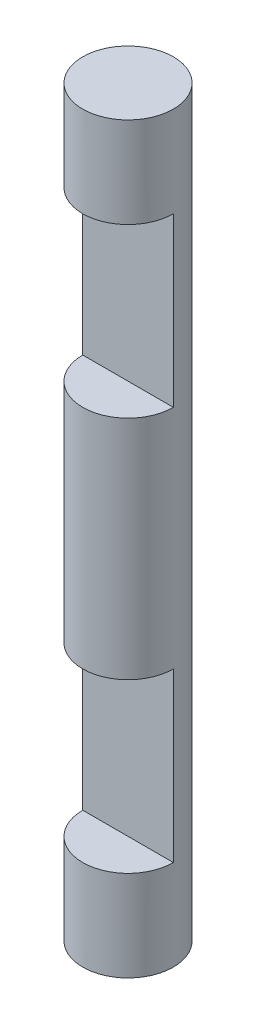
ISO-10303-21;
HEADER;
FILE_DESCRIPTION(('STEP AP214'),'2;1');
FILE_NAME('part.step','',(''),(''),'','','');
FILE_SCHEMA(('AUTOMOTIVE_DESIGN { 1 0 10303 214 1 1 1 1 }'));
ENDSEC;
DATA;
#1=APPLICATION_CONTEXT('core data for automotive mechanical design processes');
#2=APPLICATION_PROTOCOL_DEFINITION('international standard','automotive_design',2000,#1);
#3=PRODUCT_CONTEXT('',#1,'mechanical');
#4=PRODUCT('Part','Part','',(#3));
#5=PRODUCT_RELATED_PRODUCT_CATEGORY('part','',(#4));
#6=PRODUCT_DEFINITION_FORMATION('','',#4);
#7=PRODUCT_DEFINITION_CONTEXT('part definition',#1,'design');
#8=PRODUCT_DEFINITION('design','',#6,#7);
#9=PRODUCT_DEFINITION_SHAPE('','',#8);
#10=(LENGTH_UNIT() NAMED_UNIT(*) SI_UNIT(.MILLI.,.METRE.));
#11=(NAMED_UNIT(*) PLANE_ANGLE_UNIT() SI_UNIT($,.RADIAN.));
#12=(NAMED_UNIT(*) SI_UNIT($,.STERADIAN.) SOLID_ANGLE_UNIT());
#13=UNCERTAINTY_MEASURE_WITH_UNIT(LENGTH_MEASURE(1.E-05),#10,'distance_accuracy_value','');
#14=(GEOMETRIC_REPRESENTATION_CONTEXT(3) GLOBAL_UNCERTAINTY_ASSIGNED_CONTEXT((#13)) GLOBAL_UNIT_ASSIGNED_CONTEXT((#10,
#11,#12)) REPRESENTATION_CONTEXT('',''));
#15=CARTESIAN_POINT('',(0.,0.,0.));
#16=DIRECTION('',(0.,0.,1.));
#17=DIRECTION('',(1.,0.,0.));
#18=AXIS2_PLACEMENT_3D('',#15,#16,#17);
#19=CARTESIAN_POINT('',(0.,33.6284271247462,-11.));
#20=DIRECTION('',(0.,-1.,0.));
#21=DIRECTION('',(0.,0.,-1.));
#22=AXIS2_PLACEMENT_3D('',#19,#20,#21);
#23=CYLINDRICAL_SURFACE('',#22,1.);
#24=CARTESIAN_POINT('',(0.,15.4,-11.));
#25=DIRECTION('',(0.,-1.,0.));
#26=DIRECTION('',(0.,0.,-1.));
#27=AXIS2_PLACEMENT_3D('',#24,#25,#26);
#28=CIRCLE('',#27,1.);
#29=CARTESIAN_POINT('',(0.,15.4,-12.));
#30=VERTEX_POINT('',#29);
#31=EDGE_CURVE('E42',#30,#30,#28,.T.);
#32=ORIENTED_EDGE('',*,*,#31,.T.);
#33=EDGE_LOOP('',(#32));
#34=FACE_BOUND('',#33,.T.);
#35=CARTESIAN_POINT('',(0.,4.7,-11.));
#36=DIRECTION('',(0.,-1.,0.));
#37=DIRECTION('',(0.,0.,-1.));
#38=AXIS2_PLACEMENT_3D('',#35,#36,#37);
#39=CIRCLE('',#38,1.);
#40=CARTESIAN_POINT('',(1.,4.7,-11.));
#41=VERTEX_POINT('',#40);
#42=CARTESIAN_POINT('',(-1.,4.7,-11.));
#43=VERTEX_POINT('',#42);
#44=EDGE_CURVE('E88',#41,#43,#39,.T.);
#45=ORIENTED_EDGE('',*,*,#44,.F.);
#46=DIRECTION('',(0.,-1.,0.));
#47=VECTOR('',#46,1.);
#48=CARTESIAN_POINT('',(1.,33.6284271247462,-11.));
#49=LINE('',#48,#47);
#50=CARTESIAN_POINT('',(1.,1.,-11.));
#51=VERTEX_POINT('',#50);
#52=EDGE_CURVE('E87',#41,#51,#49,.T.);
#53=ORIENTED_EDGE('',*,*,#52,.T.);
#54=CARTESIAN_POINT('',(0.,1.,-11.));
#55=DIRECTION('',(0.,-1.,0.));
#56=DIRECTION('',(0.,0.,-1.));
#57=AXIS2_PLACEMENT_3D('',#54,#55,#56);
#58=CIRCLE('',#57,1.00000000000001);
#59=CARTESIAN_POINT('',(-1.00000000000001,1.,-11.));
#60=VERTEX_POINT('',#59);
#61=EDGE_CURVE('E93',#51,#60,#58,.T.);
#62=ORIENTED_EDGE('',*,*,#61,.T.);
#63=DIRECTION('',(0.,-1.,0.));
#64=VECTOR('',#63,1.);
#65=CARTESIAN_POINT('',(-1.,33.6284271247462,-11.));
#66=LINE('',#65,#64);
#67=EDGE_CURVE('E79',#60,#43,#66,.F.);
#68=ORIENTED_EDGE('',*,*,#67,.T.);
#69=EDGE_LOOP('',(#45,#53,#62,#68));
#70=FACE_BOUND('',#69,.T.);
#71=DIRECTION('',(0.,-1.,0.));
#72=VECTOR('',#71,1.);
#73=CARTESIAN_POINT('',(1.,33.6284271247462,-11.));
#74=LINE('',#73,#72);
#75=CARTESIAN_POINT('',(1.,13.4,-11.));
#76=VERTEX_POINT('',#75);
#77=CARTESIAN_POINT('',(1.,9.7,-11.));
#78=VERTEX_POINT('',#77);
#79=EDGE_CURVE('E47',#76,#78,#74,.T.);
#80=ORIENTED_EDGE('',*,*,#79,.T.);
#81=CARTESIAN_POINT('',(0.,9.7,-11.));
#82=DIRECTION('',(0.,-1.,0.));
#83=DIRECTION('',(0.,0.,-1.));
#84=AXIS2_PLACEMENT_3D('',#81,#82,#83);
#85=CIRCLE('',#84,1.);
#86=CARTESIAN_POINT('',(-1.,9.7,-11.));
#87=VERTEX_POINT('',#86);
#88=EDGE_CURVE('E12',#78,#87,#85,.T.);
#89=ORIENTED_EDGE('',*,*,#88,.T.);
#90=DIRECTION('',(0.,-1.,0.));
#91=VECTOR('',#90,1.);
#92=CARTESIAN_POINT('',(-1.,33.6284271247462,-11.));
#93=LINE('',#92,#91);
#94=CARTESIAN_POINT('',(-1.,13.4,-11.));
#95=VERTEX_POINT('',#94);
#96=EDGE_CURVE('E111',#87,#95,#93,.F.);
#97=ORIENTED_EDGE('',*,*,#96,.T.);
#98=CARTESIAN_POINT('',(0.,13.4,-11.));
#99=DIRECTION('',(0.,-1.,0.));
#100=DIRECTION('',(0.,0.,-1.));
#101=AXIS2_PLACEMENT_3D('',#98,#99,#100);
#102=CIRCLE('',#101,1.);
#103=EDGE_CURVE('E109',#76,#95,#102,.T.);
#104=ORIENTED_EDGE('',*,*,#103,.F.);
#105=EDGE_LOOP('',(#80,#89,#97,#104));
#106=FACE_BOUND('',#105,.T.);
#107=CARTESIAN_POINT('',(0.,-1.,-11.));
#108=DIRECTION('',(0.,-1.,0.));
#109=DIRECTION('',(0.,0.,-1.));
#110=AXIS2_PLACEMENT_3D('',#107,#108,#109);
#111=CIRCLE('',#110,1.00000000000001);
#112=CARTESIAN_POINT('',(0.,-1.,-12.));
#113=VERTEX_POINT('',#112);
#114=EDGE_CURVE('E96',#113,#113,#111,.T.);
#115=ORIENTED_EDGE('',*,*,#114,.F.);
#116=EDGE_LOOP('',(#115));
#117=FACE_BOUND('',#116,.T.);
#118=ADVANCED_FACE('F39',(#34,#70,#106,#117),#23,.T.);
#119=CARTESIAN_POINT('',(-11.,1.,-11.));
#120=DIRECTION('',(0.,0.,-1.));
#121=DIRECTION('',(-1.,0.,0.));
#122=AXIS2_PLACEMENT_3D('',#119,#120,#121);
#123=PLANE('',#122);
#124=DIRECTION('',(-1.,0.,0.));
#125=VECTOR('',#124,1.);
#126=CARTESIAN_POINT('',(-11.,4.7,-11.));
#127=LINE('',#126,#125);
#128=EDGE_CURVE('E60',#41,#43,#127,.T.);
#129=ORIENTED_EDGE('',*,*,#128,.T.);
#130=ORIENTED_EDGE('',*,*,#67,.F.);
#131=DIRECTION('',(-1.,0.,0.));
#132=VECTOR('',#131,1.);
#133=CARTESIAN_POINT('',(-11.,1.,-11.));
#134=LINE('',#133,#132);
#135=EDGE_CURVE('E82',#51,#60,#134,.T.);
#136=ORIENTED_EDGE('',*,*,#135,.F.);
#137=ORIENTED_EDGE('',*,*,#52,.F.);
#138=EDGE_LOOP('',(#129,#130,#136,#137));
#139=FACE_BOUND('',#138,.T.);
#140=ADVANCED_FACE('F81',(#139),#123,.F.);
#141=CARTESIAN_POINT('',(0.,4.7,0.));
#142=DIRECTION('',(0.,-1.,0.));
#143=DIRECTION('',(0.,0.,-1.));
#144=AXIS2_PLACEMENT_3D('',#141,#142,#143);
#145=PLANE('',#144);
#146=ORIENTED_EDGE('',*,*,#44,.T.);
#147=ORIENTED_EDGE('',*,*,#128,.F.);
#148=EDGE_LOOP('',(#146,#147));
#149=FACE_BOUND('',#148,.T.);
#150=ADVANCED_FACE('F130',(#149),#145,.T.);
#151=CARTESIAN_POINT('',(-11.,9.7,-11.));
#152=DIRECTION('',(0.,0.,-1.));
#153=DIRECTION('',(-1.,0.,0.));
#154=AXIS2_PLACEMENT_3D('',#151,#152,#153);
#155=PLANE('',#154);
#156=DIRECTION('',(-1.,0.,0.));
#157=VECTOR('',#156,1.);
#158=CARTESIAN_POINT('',(-11.,13.4,-11.));
#159=LINE('',#158,#157);
#160=EDGE_CURVE('E53',#76,#95,#159,.T.);
#161=ORIENTED_EDGE('',*,*,#160,.T.);
#162=ORIENTED_EDGE('',*,*,#96,.F.);
#163=DIRECTION('',(-1.,0.,0.));
#164=VECTOR('',#163,1.);
#165=CARTESIAN_POINT('',(-11.,9.7,-11.));
#166=LINE('',#165,#164);
#167=EDGE_CURVE('E102',#78,#87,#166,.T.);
#168=ORIENTED_EDGE('',*,*,#167,.F.);
#169=ORIENTED_EDGE('',*,*,#79,.F.);
#170=EDGE_LOOP('',(#161,#162,#168,#169));
#171=FACE_BOUND('',#170,.T.);
#172=ADVANCED_FACE('F119',(#171),#155,.F.);
#173=CARTESIAN_POINT('',(0.,9.7,0.));
#174=DIRECTION('',(0.,-1.,0.));
#175=DIRECTION('',(0.,0.,-1.));
#176=AXIS2_PLACEMENT_3D('',#173,#174,#175);
#177=PLANE('',#176);
#178=ORIENTED_EDGE('',*,*,#167,.T.);
#179=ORIENTED_EDGE('',*,*,#88,.F.);
#180=EDGE_LOOP('',(#178,#179));
#181=FACE_BOUND('',#180,.T.);
#182=ADVANCED_FACE('F121',(#181),#177,.F.);
#183=CARTESIAN_POINT('',(0.,13.4,0.));
#184=DIRECTION('',(0.,-1.,0.));
#185=DIRECTION('',(0.,0.,-1.));
#186=AXIS2_PLACEMENT_3D('',#183,#184,#185);
#187=PLANE('',#186);
#188=ORIENTED_EDGE('',*,*,#103,.T.);
#189=ORIENTED_EDGE('',*,*,#160,.F.);
#190=EDGE_LOOP('',(#188,#189));
#191=FACE_BOUND('',#190,.T.);
#192=ADVANCED_FACE('F123',(#191),#187,.T.);
#193=CARTESIAN_POINT('',(0.,1.,-11.));
#194=DIRECTION('',(0.,-1.,0.));
#195=DIRECTION('',(0.,0.,-1.));
#196=AXIS2_PLACEMENT_3D('',#193,#194,#195);
#197=PLANE('',#196);
#198=ORIENTED_EDGE('',*,*,#61,.F.);
#199=ORIENTED_EDGE('',*,*,#135,.T.);
#200=EDGE_LOOP('',(#198,#199));
#201=FACE_BOUND('',#200,.T.);
#202=ADVANCED_FACE('F92',(#201),#197,.F.);
#203=CARTESIAN_POINT('',(0.,-1.,-11.));
#204=DIRECTION('',(0.,-1.,0.));
#205=DIRECTION('',(0.,0.,-1.));
#206=AXIS2_PLACEMENT_3D('',#203,#204,#205);
#207=PLANE('',#206);
#208=ORIENTED_EDGE('',*,*,#114,.T.);
#209=EDGE_LOOP('',(#208));
#210=FACE_BOUND('',#209,.T.);
#211=ADVANCED_FACE('F142',(#210),#207,.T.);
#212=CARTESIAN_POINT('',(0.,15.4,0.));
#213=DIRECTION('',(0.,-1.,0.));
#214=DIRECTION('',(0.,0.,-1.));
#215=AXIS2_PLACEMENT_3D('',#212,#213,#214);
#216=PLANE('',#215);
#217=ORIENTED_EDGE('',*,*,#31,.F.);
#218=EDGE_LOOP('',(#217));
#219=FACE_BOUND('',#218,.T.);
#220=ADVANCED_FACE('F140',(#219),#216,.F.);
#221=CLOSED_SHELL('',(#118,#140,#150,#172,#182,#192,#202,#211,#220));
#222=MANIFOLD_SOLID_BREP('B2',#221);
#223=ADVANCED_BREP_SHAPE_REPRESENTATION('',(#18,#222),#14);
#224=SHAPE_DEFINITION_REPRESENTATION(#9,#223);
ENDSEC;
END-ISO-10303-21;
